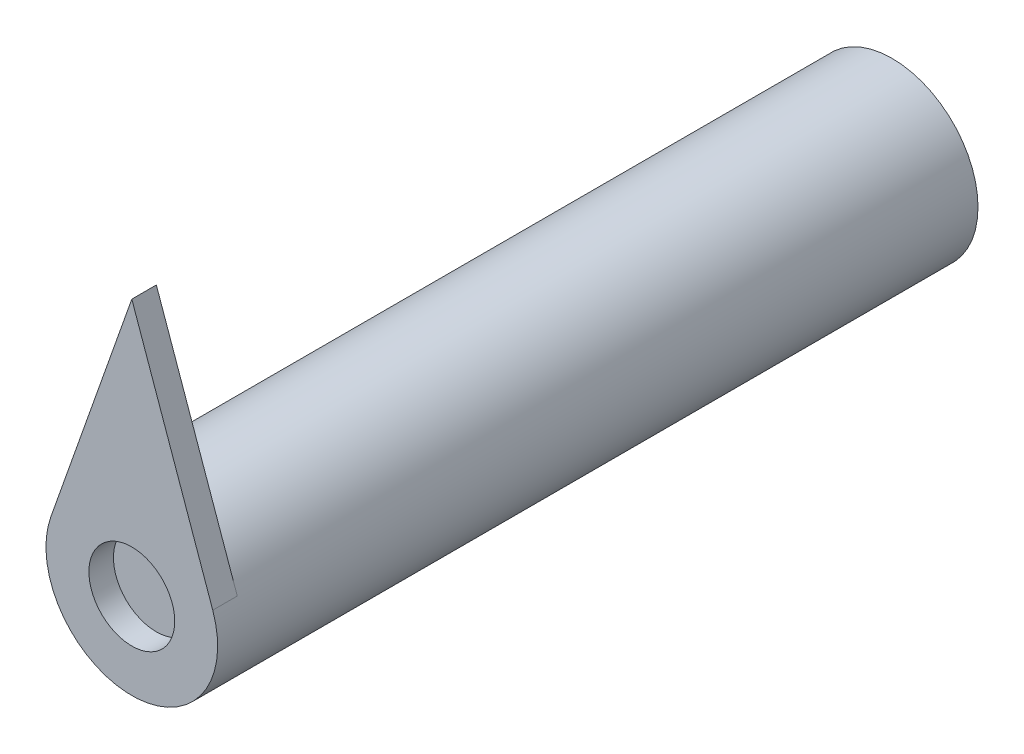
ISO-10303-21;
HEADER;
FILE_DESCRIPTION(('STEP AP214'),'2;1');
FILE_NAME('part.step','',(''),(''),'','','');
FILE_SCHEMA(('AUTOMOTIVE_DESIGN { 1 0 10303 214 1 1 1 1 }'));
ENDSEC;
DATA;
#1=APPLICATION_CONTEXT('core data for automotive mechanical design processes');
#2=APPLICATION_PROTOCOL_DEFINITION('international standard','automotive_design',2000,#1);
#3=PRODUCT_CONTEXT('',#1,'mechanical');
#4=PRODUCT('Part','Part','',(#3));
#5=PRODUCT_RELATED_PRODUCT_CATEGORY('part','',(#4));
#6=PRODUCT_DEFINITION_FORMATION('','',#4);
#7=PRODUCT_DEFINITION_CONTEXT('part definition',#1,'design');
#8=PRODUCT_DEFINITION('design','',#6,#7);
#9=PRODUCT_DEFINITION_SHAPE('','',#8);
#10=(LENGTH_UNIT() NAMED_UNIT(*) SI_UNIT(.MILLI.,.METRE.));
#11=(NAMED_UNIT(*) PLANE_ANGLE_UNIT() SI_UNIT($,.RADIAN.));
#12=(NAMED_UNIT(*) SI_UNIT($,.STERADIAN.) SOLID_ANGLE_UNIT());
#13=UNCERTAINTY_MEASURE_WITH_UNIT(LENGTH_MEASURE(1.E-05),#10,'distance_accuracy_value','');
#14=(GEOMETRIC_REPRESENTATION_CONTEXT(3) GLOBAL_UNCERTAINTY_ASSIGNED_CONTEXT((#13)) GLOBAL_UNIT_ASSIGNED_CONTEXT((#10,
#11,#12)) REPRESENTATION_CONTEXT('',''));
#15=CARTESIAN_POINT('',(0.,0.,0.));
#16=DIRECTION('',(0.,0.,1.));
#17=DIRECTION('',(1.,0.,0.));
#18=AXIS2_PLACEMENT_3D('',#15,#16,#17);
#19=CARTESIAN_POINT('',(0.,0.,30.));
#20=DIRECTION('',(0.,0.,-1.));
#21=DIRECTION('',(-1.,0.,0.));
#22=AXIS2_PLACEMENT_3D('',#19,#20,#21);
#23=CYLINDRICAL_SURFACE('',#22,3.5);
#24=CARTESIAN_POINT('',(0.,0.,30.));
#25=DIRECTION('',(0.,0.,1.));
#26=DIRECTION('',(1.,0.,0.));
#27=AXIS2_PLACEMENT_3D('',#24,#25,#26);
#28=CIRCLE('',#27,3.5);
#29=CARTESIAN_POINT('',(3.29983164553722,1.16666666666667,30.));
#30=VERTEX_POINT('',#29);
#31=CARTESIAN_POINT('',(-3.29983164553722,1.16666666666667,30.));
#32=VERTEX_POINT('',#31);
#33=EDGE_CURVE('E11',#30,#32,#28,.T.);
#34=ORIENTED_EDGE('',*,*,#33,.F.);
#35=DIRECTION('',(0.,0.,-1.));
#36=VECTOR('',#35,1.);
#37=CARTESIAN_POINT('',(3.29983164553722,1.16666666666667,31.));
#38=LINE('',#37,#36);
#39=CARTESIAN_POINT('',(3.29983164553722,1.16666666666667,31.));
#40=VERTEX_POINT('',#39);
#41=EDGE_CURVE('E87',#40,#30,#38,.T.);
#42=ORIENTED_EDGE('',*,*,#41,.F.);
#43=CARTESIAN_POINT('',(0.,0.,31.));
#44=DIRECTION('',(0.,0.,1.));
#45=DIRECTION('',(1.,0.,0.));
#46=AXIS2_PLACEMENT_3D('',#43,#44,#45);
#47=CIRCLE('',#46,3.5);
#48=CARTESIAN_POINT('',(-3.29983164553722,1.16666666666667,31.));
#49=VERTEX_POINT('',#48);
#50=EDGE_CURVE('E54',#49,#40,#47,.T.);
#51=ORIENTED_EDGE('',*,*,#50,.F.);
#52=DIRECTION('',(0.,0.,-1.));
#53=VECTOR('',#52,1.);
#54=CARTESIAN_POINT('',(-3.29983164553722,1.16666666666667,31.));
#55=LINE('',#54,#53);
#56=EDGE_CURVE('E74',#49,#32,#55,.T.);
#57=ORIENTED_EDGE('',*,*,#56,.T.);
#58=EDGE_LOOP('',(#34,#42,#51,#57));
#59=FACE_BOUND('',#58,.T.);
#60=CARTESIAN_POINT('',(0.,0.,0.));
#61=DIRECTION('',(0.,0.,1.));
#62=DIRECTION('',(1.,0.,0.));
#63=AXIS2_PLACEMENT_3D('',#60,#61,#62);
#64=CIRCLE('',#63,3.5);
#65=CARTESIAN_POINT('',(3.5,0.,0.));
#66=VERTEX_POINT('',#65);
#67=EDGE_CURVE('E36',#66,#66,#64,.T.);
#68=ORIENTED_EDGE('',*,*,#67,.T.);
#69=EDGE_LOOP('',(#68));
#70=FACE_BOUND('',#69,.T.);
#71=ADVANCED_FACE('F33',(#59,#70),#23,.T.);
#72=CARTESIAN_POINT('',(0.,0.,0.));
#73=DIRECTION('',(0.,0.,1.));
#74=DIRECTION('',(1.,0.,0.));
#75=AXIS2_PLACEMENT_3D('',#72,#73,#74);
#76=PLANE('',#75);
#77=ORIENTED_EDGE('',*,*,#67,.F.);
#78=EDGE_LOOP('',(#77));
#79=FACE_BOUND('',#78,.T.);
#80=ADVANCED_FACE('F111',(#79),#76,.F.);
#81=CARTESIAN_POINT('',(0.,0.,30.));
#82=DIRECTION('',(0.,0.,1.));
#83=DIRECTION('',(1.,0.,0.));
#84=AXIS2_PLACEMENT_3D('',#81,#82,#83);
#85=PLANE('',#84);
#86=DIRECTION('',(-0.333333333333333,0.942809041582063,0.));
#87=VECTOR('',#86,1.);
#88=CARTESIAN_POINT('',(0.,10.5,30.));
#89=LINE('',#88,#87);
#90=CARTESIAN_POINT('',(0.,10.5,30.));
#91=VERTEX_POINT('',#90);
#92=EDGE_CURVE('E84',#30,#91,#89,.T.);
#93=ORIENTED_EDGE('',*,*,#92,.F.);
#94=ORIENTED_EDGE('',*,*,#33,.T.);
#95=DIRECTION('',(-0.333333333333333,-0.942809041582063,0.));
#96=VECTOR('',#95,1.);
#97=CARTESIAN_POINT('',(0.,10.5,30.));
#98=LINE('',#97,#96);
#99=EDGE_CURVE('E81',#91,#32,#98,.T.);
#100=ORIENTED_EDGE('',*,*,#99,.F.);
#101=EDGE_LOOP('',(#93,#94,#100));
#102=FACE_BOUND('',#101,.T.);
#103=ADVANCED_FACE('F104',(#102),#85,.F.);
#104=CARTESIAN_POINT('',(0.,0.,31.));
#105=DIRECTION('',(0.,0.,1.));
#106=DIRECTION('',(1.,0.,0.));
#107=AXIS2_PLACEMENT_3D('',#104,#105,#106);
#108=PLANE('',#107);
#109=DIRECTION('',(-0.333333333333333,0.942809041582063,0.));
#110=VECTOR('',#109,1.);
#111=CARTESIAN_POINT('',(0.,10.5,31.));
#112=LINE('',#111,#110);
#113=CARTESIAN_POINT('',(0.,10.5,31.));
#114=VERTEX_POINT('',#113);
#115=EDGE_CURVE('E75',#40,#114,#112,.T.);
#116=ORIENTED_EDGE('',*,*,#115,.T.);
#117=DIRECTION('',(-0.333333333333333,-0.942809041582063,0.));
#118=VECTOR('',#117,1.);
#119=CARTESIAN_POINT('',(0.,10.5,31.));
#120=LINE('',#119,#118);
#121=EDGE_CURVE('E69',#114,#49,#120,.T.);
#122=ORIENTED_EDGE('',*,*,#121,.T.);
#123=ORIENTED_EDGE('',*,*,#50,.T.);
#124=EDGE_LOOP('',(#116,#122,#123));
#125=FACE_BOUND('',#124,.T.);
#126=CARTESIAN_POINT('',(0.,0.,31.));
#127=DIRECTION('',(0.,0.,1.));
#128=DIRECTION('',(1.,0.,0.));
#129=AXIS2_PLACEMENT_3D('',#126,#127,#128);
#130=CIRCLE('',#129,1.75);
#131=CARTESIAN_POINT('',(1.75,0.,31.));
#132=VERTEX_POINT('',#131);
#133=EDGE_CURVE('E93',#132,#132,#130,.T.);
#134=ORIENTED_EDGE('',*,*,#133,.F.);
#135=EDGE_LOOP('',(#134));
#136=FACE_BOUND('',#135,.T.);
#137=ADVANCED_FACE('F78',(#125,#136),#108,.T.);
#138=CARTESIAN_POINT('',(0.,10.5,31.));
#139=DIRECTION('',(-0.942809041582063,-0.333333333333333,0.));
#140=DIRECTION('',(0.333333333333333,-0.942809041582063,0.));
#141=AXIS2_PLACEMENT_3D('',#138,#139,#140);
#142=PLANE('',#141);
#143=ORIENTED_EDGE('',*,*,#92,.T.);
#144=DIRECTION('',(0.,0.,-1.));
#145=VECTOR('',#144,1.);
#146=CARTESIAN_POINT('',(0.,10.5,31.));
#147=LINE('',#146,#145);
#148=EDGE_CURVE('E72',#114,#91,#147,.T.);
#149=ORIENTED_EDGE('',*,*,#148,.F.);
#150=ORIENTED_EDGE('',*,*,#115,.F.);
#151=ORIENTED_EDGE('',*,*,#41,.T.);
#152=EDGE_LOOP('',(#143,#149,#150,#151));
#153=FACE_BOUND('',#152,.T.);
#154=ADVANCED_FACE('F83',(#153),#142,.F.);
#155=CARTESIAN_POINT('',(0.,10.5,31.));
#156=DIRECTION('',(0.942809041582063,-0.333333333333333,0.));
#157=DIRECTION('',(0.333333333333333,0.942809041582063,0.));
#158=AXIS2_PLACEMENT_3D('',#155,#156,#157);
#159=PLANE('',#158);
#160=ORIENTED_EDGE('',*,*,#99,.T.);
#161=ORIENTED_EDGE('',*,*,#56,.F.);
#162=ORIENTED_EDGE('',*,*,#121,.F.);
#163=ORIENTED_EDGE('',*,*,#148,.T.);
#164=EDGE_LOOP('',(#160,#161,#162,#163));
#165=FACE_BOUND('',#164,.T.);
#166=ADVANCED_FACE('F70',(#165),#159,.F.);
#167=CARTESIAN_POINT('',(0.,0.,31.));
#168=DIRECTION('',(0.,0.,-1.));
#169=DIRECTION('',(-1.,0.,0.));
#170=AXIS2_PLACEMENT_3D('',#167,#168,#169);
#171=CYLINDRICAL_SURFACE('',#170,1.75);
#172=ORIENTED_EDGE('',*,*,#133,.T.);
#173=EDGE_LOOP('',(#172));
#174=FACE_BOUND('',#173,.T.);
#175=CARTESIAN_POINT('',(0.,0.,30.));
#176=DIRECTION('',(0.,0.,1.));
#177=DIRECTION('',(1.,0.,0.));
#178=AXIS2_PLACEMENT_3D('',#175,#176,#177);
#179=CIRCLE('',#178,1.75);
#180=CARTESIAN_POINT('',(1.75,0.,30.));
#181=VERTEX_POINT('',#180);
#182=EDGE_CURVE('E95',#181,#181,#179,.T.);
#183=ORIENTED_EDGE('',*,*,#182,.F.);
#184=EDGE_LOOP('',(#183));
#185=FACE_BOUND('',#184,.T.);
#186=ADVANCED_FACE('F101',(#174,#185),#171,.F.);
#187=CARTESIAN_POINT('',(0.,0.,30.));
#188=DIRECTION('',(0.,0.,1.));
#189=DIRECTION('',(1.,0.,0.));
#190=AXIS2_PLACEMENT_3D('',#187,#188,#189);
#191=PLANE('',#190);
#192=ORIENTED_EDGE('',*,*,#182,.T.);
#193=EDGE_LOOP('',(#192));
#194=FACE_BOUND('',#193,.T.);
#195=ADVANCED_FACE('F125',(#194),#191,.T.);
#196=CLOSED_SHELL('',(#71,#80,#103,#137,#154,#166,#186,#195));
#197=MANIFOLD_SOLID_BREP('B2',#196);
#198=ADVANCED_BREP_SHAPE_REPRESENTATION('',(#18,#197),#14);
#199=SHAPE_DEFINITION_REPRESENTATION(#9,#198);
ENDSEC;
END-ISO-10303-21;
